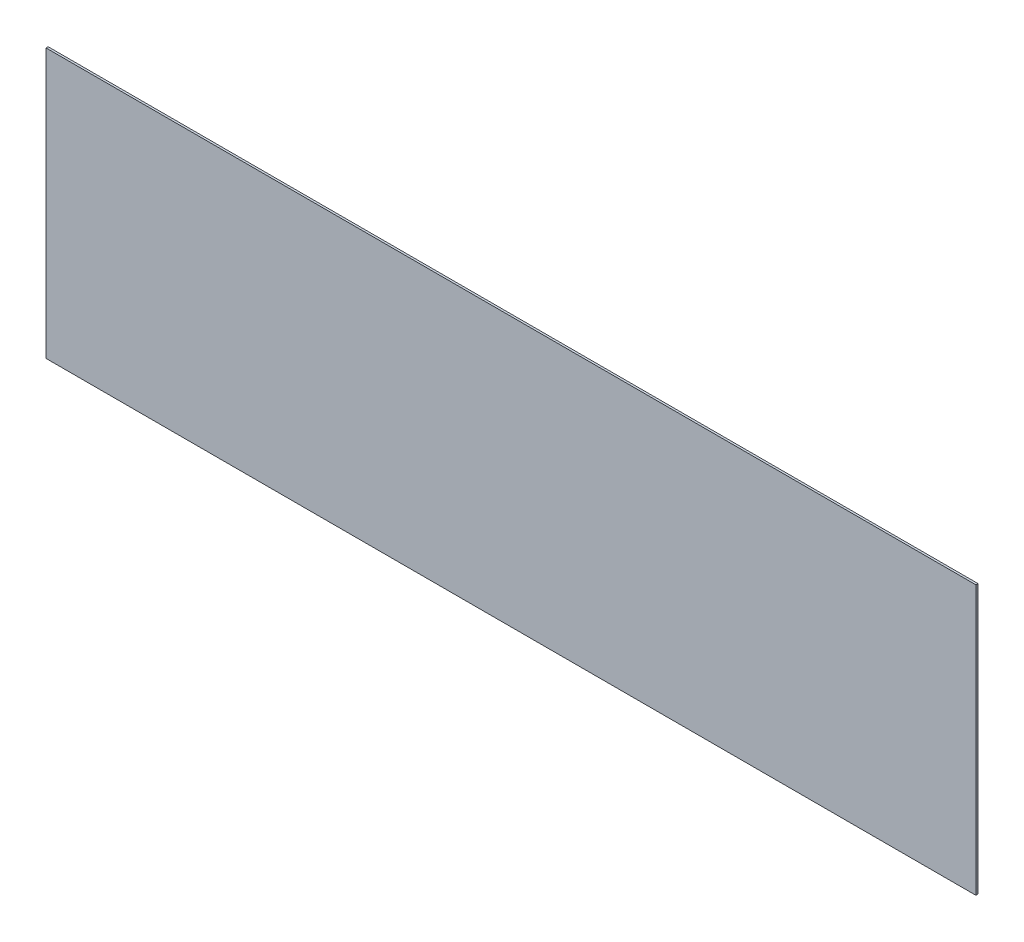
ISO-10303-21;
HEADER;
FILE_DESCRIPTION(('STEP AP214'),'2;1');
FILE_NAME('part.step','',(''),(''),'','','');
FILE_SCHEMA(('AUTOMOTIVE_DESIGN { 1 0 10303 214 1 1 1 1 }'));
ENDSEC;
DATA;
#1=APPLICATION_CONTEXT('core data for automotive mechanical design processes');
#2=APPLICATION_PROTOCOL_DEFINITION('international standard','automotive_design',2000,#1);
#3=PRODUCT_CONTEXT('',#1,'mechanical');
#4=PRODUCT('Part','Part','',(#3));
#5=PRODUCT_RELATED_PRODUCT_CATEGORY('part','',(#4));
#6=PRODUCT_DEFINITION_FORMATION('','',#4);
#7=PRODUCT_DEFINITION_CONTEXT('part definition',#1,'design');
#8=PRODUCT_DEFINITION('design','',#6,#7);
#9=PRODUCT_DEFINITION_SHAPE('','',#8);
#10=(LENGTH_UNIT() NAMED_UNIT(*) SI_UNIT(.MILLI.,.METRE.));
#11=(NAMED_UNIT(*) PLANE_ANGLE_UNIT() SI_UNIT($,.RADIAN.));
#12=(NAMED_UNIT(*) SI_UNIT($,.STERADIAN.) SOLID_ANGLE_UNIT());
#13=UNCERTAINTY_MEASURE_WITH_UNIT(LENGTH_MEASURE(1.E-05),#10,'distance_accuracy_value','');
#14=(GEOMETRIC_REPRESENTATION_CONTEXT(3) GLOBAL_UNCERTAINTY_ASSIGNED_CONTEXT((#13)) GLOBAL_UNIT_ASSIGNED_CONTEXT((#10,
#11,#12)) REPRESENTATION_CONTEXT('',''));
#15=CARTESIAN_POINT('',(0.,0.,0.));
#16=DIRECTION('',(0.,0.,1.));
#17=DIRECTION('',(1.,0.,0.));
#18=AXIS2_PLACEMENT_3D('',#15,#16,#17);
#19=CARTESIAN_POINT('',(21.5,10.,-800.));
#20=DIRECTION('',(-1.,0.,0.));
#21=DIRECTION('',(0.,0.,1.));
#22=AXIS2_PLACEMENT_3D('',#19,#20,#21);
#23=PLANE('',#22);
#24=DIRECTION('',(0.,-1.,0.));
#25=VECTOR('',#24,1.);
#26=CARTESIAN_POINT('',(21.5,10.,-798.5));
#27=LINE('',#26,#25);
#28=CARTESIAN_POINT('',(21.5,200.,-798.5));
#29=VERTEX_POINT('',#28);
#30=CARTESIAN_POINT('',(21.5,10.,-798.5));
#31=VERTEX_POINT('',#30);
#32=EDGE_CURVE('E103',#29,#31,#27,.T.);
#33=ORIENTED_EDGE('',*,*,#32,.F.);
#34=DIRECTION('',(0.,0.,1.));
#35=VECTOR('',#34,1.);
#36=CARTESIAN_POINT('',(21.5,200.,-800.));
#37=LINE('',#36,#35);
#38=CARTESIAN_POINT('',(21.5,200.,-800.));
#39=VERTEX_POINT('',#38);
#40=EDGE_CURVE('E11',#39,#29,#37,.T.);
#41=ORIENTED_EDGE('',*,*,#40,.F.);
#42=DIRECTION('',(0.,-1.,0.));
#43=VECTOR('',#42,1.);
#44=CARTESIAN_POINT('',(21.5,10.,-800.));
#45=LINE('',#44,#43);
#46=CARTESIAN_POINT('',(21.5,10.,-800.));
#47=VERTEX_POINT('',#46);
#48=EDGE_CURVE('E97',#39,#47,#45,.T.);
#49=ORIENTED_EDGE('',*,*,#48,.T.);
#50=DIRECTION('',(0.,0.,1.));
#51=VECTOR('',#50,1.);
#52=CARTESIAN_POINT('',(21.5,10.,-800.));
#53=LINE('',#52,#51);
#54=EDGE_CURVE('E42',#47,#31,#53,.T.);
#55=ORIENTED_EDGE('',*,*,#54,.T.);
#56=EDGE_LOOP('',(#33,#41,#49,#55));
#57=FACE_BOUND('',#56,.T.);
#58=ADVANCED_FACE('F39',(#57),#23,.T.);
#59=CARTESIAN_POINT('',(21.5,200.,-800.));
#60=DIRECTION('',(0.,1.,0.));
#61=DIRECTION('',(0.,0.,1.));
#62=AXIS2_PLACEMENT_3D('',#59,#60,#61);
#63=PLANE('',#62);
#64=DIRECTION('',(-1.,0.,0.));
#65=VECTOR('',#64,1.);
#66=CARTESIAN_POINT('',(21.5,200.,-798.5));
#67=LINE('',#66,#65);
#68=CARTESIAN_POINT('',(678.5,200.,-798.5));
#69=VERTEX_POINT('',#68);
#70=EDGE_CURVE('E99',#69,#29,#67,.T.);
#71=ORIENTED_EDGE('',*,*,#70,.F.);
#72=DIRECTION('',(0.,0.,1.));
#73=VECTOR('',#72,1.);
#74=CARTESIAN_POINT('',(678.5,200.,-800.));
#75=LINE('',#74,#73);
#76=CARTESIAN_POINT('',(678.5,200.,-800.));
#77=VERTEX_POINT('',#76);
#78=EDGE_CURVE('E48',#77,#69,#75,.T.);
#79=ORIENTED_EDGE('',*,*,#78,.F.);
#80=DIRECTION('',(-1.,0.,0.));
#81=VECTOR('',#80,1.);
#82=CARTESIAN_POINT('',(21.5,200.,-800.));
#83=LINE('',#82,#81);
#84=EDGE_CURVE('E94',#77,#39,#83,.T.);
#85=ORIENTED_EDGE('',*,*,#84,.T.);
#86=ORIENTED_EDGE('',*,*,#40,.T.);
#87=EDGE_LOOP('',(#71,#79,#85,#86));
#88=FACE_BOUND('',#87,.T.);
#89=ADVANCED_FACE('F113',(#88),#63,.T.);
#90=CARTESIAN_POINT('',(678.5,10.,-800.));
#91=DIRECTION('',(1.,0.,0.));
#92=DIRECTION('',(0.,0.,-1.));
#93=AXIS2_PLACEMENT_3D('',#90,#91,#92);
#94=PLANE('',#93);
#95=DIRECTION('',(0.,1.,0.));
#96=VECTOR('',#95,1.);
#97=CARTESIAN_POINT('',(678.5,10.,-798.5));
#98=LINE('',#97,#96);
#99=CARTESIAN_POINT('',(678.5,10.,-798.5));
#100=VERTEX_POINT('',#99);
#101=EDGE_CURVE('E89',#100,#69,#98,.T.);
#102=ORIENTED_EDGE('',*,*,#101,.F.);
#103=DIRECTION('',(0.,0.,1.));
#104=VECTOR('',#103,1.);
#105=CARTESIAN_POINT('',(678.5,10.,-800.));
#106=LINE('',#105,#104);
#107=CARTESIAN_POINT('',(678.5,10.,-800.));
#108=VERTEX_POINT('',#107);
#109=EDGE_CURVE('E84',#108,#100,#106,.T.);
#110=ORIENTED_EDGE('',*,*,#109,.F.);
#111=DIRECTION('',(0.,1.,0.));
#112=VECTOR('',#111,1.);
#113=CARTESIAN_POINT('',(678.5,10.,-800.));
#114=LINE('',#113,#112);
#115=EDGE_CURVE('E87',#108,#77,#114,.T.);
#116=ORIENTED_EDGE('',*,*,#115,.T.);
#117=ORIENTED_EDGE('',*,*,#78,.T.);
#118=EDGE_LOOP('',(#102,#110,#116,#117));
#119=FACE_BOUND('',#118,.T.);
#120=ADVANCED_FACE('F86',(#119),#94,.T.);
#121=CARTESIAN_POINT('',(21.5,10.,-800.));
#122=DIRECTION('',(0.,-1.,0.));
#123=DIRECTION('',(0.,0.,-1.));
#124=AXIS2_PLACEMENT_3D('',#121,#122,#123);
#125=PLANE('',#124);
#126=DIRECTION('',(1.,0.,0.));
#127=VECTOR('',#126,1.);
#128=CARTESIAN_POINT('',(21.5,10.,-798.5));
#129=LINE('',#128,#127);
#130=EDGE_CURVE('E106',#31,#100,#129,.T.);
#131=ORIENTED_EDGE('',*,*,#130,.F.);
#132=ORIENTED_EDGE('',*,*,#54,.F.);
#133=DIRECTION('',(1.,0.,0.));
#134=VECTOR('',#133,1.);
#135=CARTESIAN_POINT('',(21.5,10.,-800.));
#136=LINE('',#135,#134);
#137=EDGE_CURVE('E93',#47,#108,#136,.T.);
#138=ORIENTED_EDGE('',*,*,#137,.T.);
#139=ORIENTED_EDGE('',*,*,#109,.T.);
#140=EDGE_LOOP('',(#131,#132,#138,#139));
#141=FACE_BOUND('',#140,.T.);
#142=ADVANCED_FACE('F96',(#141),#125,.T.);
#143=CARTESIAN_POINT('',(0.,0.,-800.));
#144=DIRECTION('',(0.,0.,-1.));
#145=DIRECTION('',(-1.,0.,0.));
#146=AXIS2_PLACEMENT_3D('',#143,#144,#145);
#147=PLANE('',#146);
#148=ORIENTED_EDGE('',*,*,#48,.F.);
#149=ORIENTED_EDGE('',*,*,#84,.F.);
#150=ORIENTED_EDGE('',*,*,#115,.F.);
#151=ORIENTED_EDGE('',*,*,#137,.F.);
#152=EDGE_LOOP('',(#148,#149,#150,#151));
#153=FACE_BOUND('',#152,.T.);
#154=ADVANCED_FACE('F92',(#153),#147,.T.);
#155=CARTESIAN_POINT('',(0.,0.,-798.5));
#156=DIRECTION('',(0.,0.,-1.));
#157=DIRECTION('',(-1.,0.,0.));
#158=AXIS2_PLACEMENT_3D('',#155,#156,#157);
#159=PLANE('',#158);
#160=ORIENTED_EDGE('',*,*,#32,.T.);
#161=ORIENTED_EDGE('',*,*,#130,.T.);
#162=ORIENTED_EDGE('',*,*,#101,.T.);
#163=ORIENTED_EDGE('',*,*,#70,.T.);
#164=EDGE_LOOP('',(#160,#161,#162,#163));
#165=FACE_BOUND('',#164,.T.);
#166=ADVANCED_FACE('F112',(#165),#159,.F.);
#167=CLOSED_SHELL('',(#58,#89,#120,#142,#154,#166));
#168=MANIFOLD_SOLID_BREP('B2',#167);
#169=ADVANCED_BREP_SHAPE_REPRESENTATION('',(#18,#168),#14);
#170=SHAPE_DEFINITION_REPRESENTATION(#9,#169);
ENDSEC;
END-ISO-10303-21;
